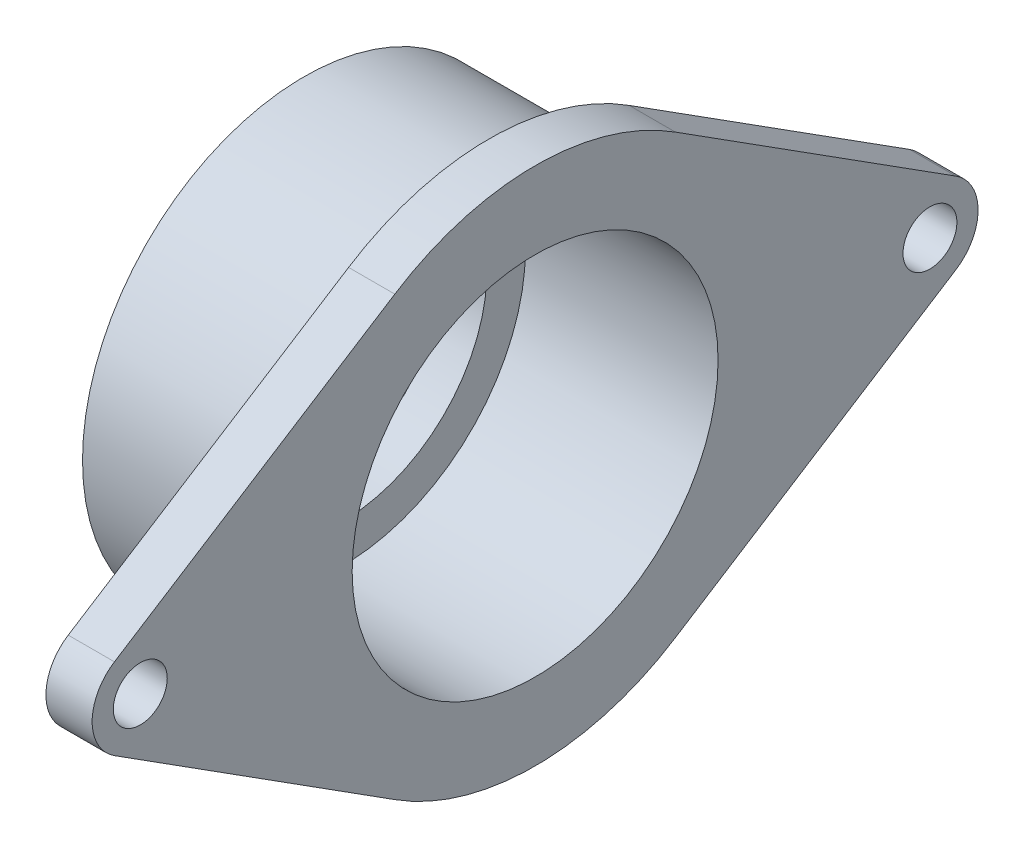
ISO-10303-21;
HEADER;
FILE_DESCRIPTION(('STEP AP214'),'2;1');
FILE_NAME('part.step','',(''),(''),'','','');
FILE_SCHEMA(('AUTOMOTIVE_DESIGN { 1 0 10303 214 1 1 1 1 }'));
ENDSEC;
DATA;
#1=APPLICATION_CONTEXT('core data for automotive mechanical design processes');
#2=APPLICATION_PROTOCOL_DEFINITION('international standard','automotive_design',2000,#1);
#3=PRODUCT_CONTEXT('',#1,'mechanical');
#4=PRODUCT('Part','Part','',(#3));
#5=PRODUCT_RELATED_PRODUCT_CATEGORY('part','',(#4));
#6=PRODUCT_DEFINITION_FORMATION('','',#4);
#7=PRODUCT_DEFINITION_CONTEXT('part definition',#1,'design');
#8=PRODUCT_DEFINITION('design','',#6,#7);
#9=PRODUCT_DEFINITION_SHAPE('','',#8);
#10=(LENGTH_UNIT() NAMED_UNIT(*) SI_UNIT(.MILLI.,.METRE.));
#11=(NAMED_UNIT(*) PLANE_ANGLE_UNIT() SI_UNIT($,.RADIAN.));
#12=(NAMED_UNIT(*) SI_UNIT($,.STERADIAN.) SOLID_ANGLE_UNIT());
#13=UNCERTAINTY_MEASURE_WITH_UNIT(LENGTH_MEASURE(1.E-05),#10,'distance_accuracy_value','');
#14=(GEOMETRIC_REPRESENTATION_CONTEXT(3) GLOBAL_UNCERTAINTY_ASSIGNED_CONTEXT((#13)) GLOBAL_UNIT_ASSIGNED_CONTEXT((#10,
#11,#12)) REPRESENTATION_CONTEXT('',''));
#15=CARTESIAN_POINT('',(0.,0.,0.));
#16=DIRECTION('',(0.,0.,1.));
#17=DIRECTION('',(1.,0.,0.));
#18=AXIS2_PLACEMENT_3D('',#15,#16,#17);
#19=CARTESIAN_POINT('',(-85.8939756869317,-12.8582856635851,0.));
#20=DIRECTION('',(-1.,0.,0.));
#21=DIRECTION('',(0.,0.,1.));
#22=AXIS2_PLACEMENT_3D('',#19,#20,#21);
#23=CYLINDRICAL_SURFACE('',#22,57.5);
#24=CARTESIAN_POINT('',(-85.8939756869318,-12.8582856635851,0.));
#25=DIRECTION('',(-1.,0.,0.));
#26=DIRECTION('',(0.,0.,1.));
#27=AXIS2_PLACEMENT_3D('',#24,#25,#26);
#28=CIRCLE('',#27,57.5);
#29=CARTESIAN_POINT('',(-85.8939756869318,-12.8582856635851,57.5));
#30=VERTEX_POINT('',#29);
#31=EDGE_CURVE('E176',#30,#30,#28,.T.);
#32=ORIENTED_EDGE('',*,*,#31,.F.);
#33=EDGE_LOOP('',(#32));
#34=FACE_BOUND('',#33,.T.);
#35=CARTESIAN_POINT('',(-37.8939756869318,-12.8582856635851,0.));
#36=DIRECTION('',(1.,0.,0.));
#37=DIRECTION('',(0.,0.,-1.));
#38=AXIS2_PLACEMENT_3D('',#35,#36,#37);
#39=CIRCLE('',#38,57.5);
#40=CARTESIAN_POINT('',(-37.8939756869318,-12.8582856635851,-57.5));
#41=VERTEX_POINT('',#40);
#42=EDGE_CURVE('E11',#41,#41,#39,.T.);
#43=ORIENTED_EDGE('',*,*,#42,.F.);
#44=EDGE_LOOP('',(#43));
#45=FACE_BOUND('',#44,.T.);
#46=ADVANCED_FACE('F34',(#34,#45),#23,.T.);
#47=CARTESIAN_POINT('',(-85.8939756869317,-12.8582856635851,0.));
#48=DIRECTION('',(-1.,0.,0.));
#49=DIRECTION('',(0.,0.,1.));
#50=AXIS2_PLACEMENT_3D('',#47,#48,#49);
#51=CYLINDRICAL_SURFACE('',#50,47.5);
#52=CARTESIAN_POINT('',(-25.8939756869318,-12.8582856635851,0.));
#53=DIRECTION('',(-1.,0.,0.));
#54=DIRECTION('',(0.,0.,1.));
#55=AXIS2_PLACEMENT_3D('',#52,#53,#54);
#56=CIRCLE('',#55,47.5);
#57=CARTESIAN_POINT('',(-25.8939756869318,-12.8582856635851,47.5));
#58=VERTEX_POINT('',#57);
#59=EDGE_CURVE('E43',#58,#58,#56,.T.);
#60=ORIENTED_EDGE('',*,*,#59,.F.);
#61=EDGE_LOOP('',(#60));
#62=FACE_BOUND('',#61,.T.);
#63=CARTESIAN_POINT('',(-75.8939756869318,-12.8582856635851,0.));
#64=DIRECTION('',(-1.,0.,0.));
#65=DIRECTION('',(0.,0.,1.));
#66=AXIS2_PLACEMENT_3D('',#63,#64,#65);
#67=CIRCLE('',#66,47.5);
#68=CARTESIAN_POINT('',(-75.8939756869318,-12.8582856635851,47.5));
#69=VERTEX_POINT('',#68);
#70=EDGE_CURVE('E158',#69,#69,#67,.T.);
#71=ORIENTED_EDGE('',*,*,#70,.T.);
#72=EDGE_LOOP('',(#71));
#73=FACE_BOUND('',#72,.T.);
#74=ADVANCED_FACE('F36',(#62,#73),#51,.F.);
#75=CARTESIAN_POINT('',(-25.8939756869318,0.,0.));
#76=DIRECTION('',(-1.,0.,0.));
#77=DIRECTION('',(0.,0.,1.));
#78=AXIS2_PLACEMENT_3D('',#75,#76,#77);
#79=PLANE('',#78);
#80=CARTESIAN_POINT('',(-25.8939756869318,-12.8582856636099,102.500000000016));
#81=DIRECTION('',(1.,0.,0.));
#82=DIRECTION('',(0.,0.,-1.));
#83=AXIS2_PLACEMENT_3D('',#80,#81,#82);
#84=CIRCLE('',#83,7.);
#85=CARTESIAN_POINT('',(-25.8939756869318,-12.8582856636099,95.5000000000157));
#86=VERTEX_POINT('',#85);
#87=EDGE_CURVE('E256',#86,#86,#84,.T.);
#88=ORIENTED_EDGE('',*,*,#87,.F.);
#89=EDGE_LOOP('',(#88));
#90=FACE_BOUND('',#89,.T.);
#91=CARTESIAN_POINT('',(-25.8939756869318,-12.8582856635604,-102.500000000016));
#92=DIRECTION('',(1.,0.,0.));
#93=DIRECTION('',(0.,0.,-1.));
#94=AXIS2_PLACEMENT_3D('',#91,#92,#93);
#95=CIRCLE('',#94,7.);
#96=CARTESIAN_POINT('',(-25.8939756869318,-12.8582856635604,-109.500000000016));
#97=VERTEX_POINT('',#96);
#98=EDGE_CURVE('E259',#97,#97,#95,.T.);
#99=ORIENTED_EDGE('',*,*,#98,.F.);
#100=EDGE_LOOP('',(#99));
#101=FACE_BOUND('',#100,.T.);
#102=ORIENTED_EDGE('',*,*,#59,.T.);
#103=EDGE_LOOP('',(#102));
#104=FACE_BOUND('',#103,.T.);
#105=CARTESIAN_POINT('',(-25.8939756869318,-12.8582856635851,0.));
#106=DIRECTION('',(1.,0.,0.));
#107=DIRECTION('',(0.,0.,-1.));
#108=AXIS2_PLACEMENT_3D('',#105,#106,#107);
#109=CIRCLE('',#108,67.5);
#110=CARTESIAN_POINT('',(-25.8939756869318,-69.6866497760731,36.4250879518292));
#111=VERTEX_POINT('',#110);
#112=CARTESIAN_POINT('',(-25.8939756869318,-69.686649776073,-36.4250879518293));
#113=VERTEX_POINT('',#112);
#114=EDGE_CURVE('E134',#111,#113,#109,.T.);
#115=ORIENTED_EDGE('',*,*,#114,.T.);
#116=DIRECTION('',(0.,0.536581054766727,-0.843848784833768));
#117=VECTOR('',#116,1.);
#118=CARTESIAN_POINT('',(-25.8939756869318,-69.686649776073,-36.4250879518293));
#119=LINE('',#118,#117);
#120=CARTESIAN_POINT('',(-25.8939756869318,-23.406395474,-109.207263184572));
#121=VERTEX_POINT('',#120);
#122=EDGE_CURVE('E137',#113,#121,#119,.T.);
#123=ORIENTED_EDGE('',*,*,#122,.T.);
#124=CARTESIAN_POINT('',(-25.8939756869318,-12.8582856635604,-102.500000000016));
#125=DIRECTION('',(1.,0.,0.));
#126=DIRECTION('',(0.,0.,-1.));
#127=AXIS2_PLACEMENT_3D('',#124,#125,#126);
#128=CIRCLE('',#127,12.5);
#129=CARTESIAN_POINT('',(-25.8939756869318,-2.31017585313501,-109.207263184595));
#130=VERTEX_POINT('',#129);
#131=EDGE_CURVE('E141',#121,#130,#128,.T.);
#132=ORIENTED_EDGE('',*,*,#131,.T.);
#133=DIRECTION('',(0.,0.536581054766318,0.843848784834028));
#134=VECTOR('',#133,1.);
#135=CARTESIAN_POINT('',(-25.8939756869318,43.9700784489028,-36.4250879518292));
#136=LINE('',#135,#134);
#137=CARTESIAN_POINT('',(-25.8939756869318,43.9700784489028,-36.4250879518292));
#138=VERTEX_POINT('',#137);
#139=EDGE_CURVE('E144',#130,#138,#136,.T.);
#140=ORIENTED_EDGE('',*,*,#139,.T.);
#141=CARTESIAN_POINT('',(-25.8939756869318,-12.8582856635851,0.));
#142=DIRECTION('',(1.,0.,0.));
#143=DIRECTION('',(0.,0.,-1.));
#144=AXIS2_PLACEMENT_3D('',#141,#142,#143);
#145=CIRCLE('',#144,67.5);
#146=CARTESIAN_POINT('',(-25.8939756869318,43.9700784488884,36.4250879518517));
#147=VERTEX_POINT('',#146);
#148=EDGE_CURVE('E147',#138,#147,#145,.T.);
#149=ORIENTED_EDGE('',*,*,#148,.T.);
#150=DIRECTION('',(0.,-0.536581054766727,0.843848784833768));
#151=VECTOR('',#150,1.);
#152=CARTESIAN_POINT('',(-25.8939756869318,43.9700784488884,36.4250879518517));
#153=LINE('',#152,#151);
#154=CARTESIAN_POINT('',(-25.8939756869318,-2.31017585318461,109.207263184595));
#155=VERTEX_POINT('',#154);
#156=EDGE_CURVE('E150',#147,#155,#153,.T.);
#157=ORIENTED_EDGE('',*,*,#156,.T.);
#158=CARTESIAN_POINT('',(-25.8939756869318,-12.8582856636099,102.500000000016));
#159=DIRECTION('',(1.,0.,0.));
#160=DIRECTION('',(0.,0.,-1.));
#161=AXIS2_PLACEMENT_3D('',#158,#159,#160);
#162=CIRCLE('',#161,12.5);
#163=CARTESIAN_POINT('',(-25.8939756869318,-23.4063954740352,109.207263184595));
#164=VERTEX_POINT('',#163);
#165=EDGE_CURVE('E111',#155,#164,#162,.T.);
#166=ORIENTED_EDGE('',*,*,#165,.T.);
#167=DIRECTION('',(0.,-0.536581054766319,-0.843848784834027));
#168=VECTOR('',#167,1.);
#169=CARTESIAN_POINT('',(-25.8939756869318,-69.6866497760731,36.4250879518292));
#170=LINE('',#169,#168);
#171=EDGE_CURVE('E153',#164,#111,#170,.T.);
#172=ORIENTED_EDGE('',*,*,#171,.T.);
#173=EDGE_LOOP('',(#115,#123,#132,#140,#149,#157,#166,#172));
#174=FACE_BOUND('',#173,.T.);
#175=ADVANCED_FACE('F181',(#90,#101,#104,#174),#79,.F.);
#176=CARTESIAN_POINT('',(-85.8939756869317,0.,0.));
#177=DIRECTION('',(1.,0.,0.));
#178=DIRECTION('',(0.,0.,-1.));
#179=AXIS2_PLACEMENT_3D('',#176,#177,#178);
#180=PLANE('',#179);
#181=CARTESIAN_POINT('',(-85.8939756869317,-12.8582856635851,0.));
#182=DIRECTION('',(-1.,0.,0.));
#183=DIRECTION('',(0.,0.,1.));
#184=AXIS2_PLACEMENT_3D('',#181,#182,#183);
#185=CIRCLE('',#184,37.5);
#186=CARTESIAN_POINT('',(-85.8939756869317,-12.8582856635851,37.5));
#187=VERTEX_POINT('',#186);
#188=EDGE_CURVE('E173',#187,#187,#185,.T.);
#189=ORIENTED_EDGE('',*,*,#188,.F.);
#190=EDGE_LOOP('',(#189));
#191=FACE_BOUND('',#190,.T.);
#192=ORIENTED_EDGE('',*,*,#31,.T.);
#193=EDGE_LOOP('',(#192));
#194=FACE_BOUND('',#193,.T.);
#195=ADVANCED_FACE('F198',(#191,#194),#180,.F.);
#196=CARTESIAN_POINT('',(-85.8939756869317,-12.8582856635851,0.));
#197=DIRECTION('',(-1.,0.,0.));
#198=DIRECTION('',(0.,0.,1.));
#199=AXIS2_PLACEMENT_3D('',#196,#197,#198);
#200=CYLINDRICAL_SURFACE('',#199,37.5);
#201=CARTESIAN_POINT('',(-75.8939756869318,-12.8582856635851,0.));
#202=DIRECTION('',(-1.,0.,0.));
#203=DIRECTION('',(0.,0.,1.));
#204=AXIS2_PLACEMENT_3D('',#201,#202,#203);
#205=CIRCLE('',#204,37.5);
#206=CARTESIAN_POINT('',(-75.8939756869318,-12.8582856635851,37.5));
#207=VERTEX_POINT('',#206);
#208=EDGE_CURVE('E170',#207,#207,#205,.T.);
#209=ORIENTED_EDGE('',*,*,#208,.F.);
#210=EDGE_LOOP('',(#209));
#211=FACE_BOUND('',#210,.T.);
#212=ORIENTED_EDGE('',*,*,#188,.T.);
#213=EDGE_LOOP('',(#212));
#214=FACE_BOUND('',#213,.T.);
#215=ADVANCED_FACE('F192',(#211,#214),#200,.F.);
#216=CARTESIAN_POINT('',(-75.8939756869318,0.,0.));
#217=DIRECTION('',(-1.,0.,0.));
#218=DIRECTION('',(0.,0.,1.));
#219=AXIS2_PLACEMENT_3D('',#216,#217,#218);
#220=PLANE('',#219);
#221=ORIENTED_EDGE('',*,*,#70,.F.);
#222=EDGE_LOOP('',(#221));
#223=FACE_BOUND('',#222,.T.);
#224=ORIENTED_EDGE('',*,*,#208,.T.);
#225=EDGE_LOOP('',(#224));
#226=FACE_BOUND('',#225,.T.);
#227=ADVANCED_FACE('F188',(#223,#226),#220,.F.);
#228=CARTESIAN_POINT('',(-37.8939756869318,-12.8582856635851,0.));
#229=DIRECTION('',(1.,0.,0.));
#230=DIRECTION('',(0.,0.,-1.));
#231=AXIS2_PLACEMENT_3D('',#228,#229,#230);
#232=CYLINDRICAL_SURFACE('',#231,67.5);
#233=ORIENTED_EDGE('',*,*,#114,.F.);
#234=DIRECTION('',(1.,0.,0.));
#235=VECTOR('',#234,1.);
#236=CARTESIAN_POINT('',(-37.8939756869318,-69.6866497760731,36.4250879518292));
#237=LINE('',#236,#235);
#238=CARTESIAN_POINT('',(-37.8939756869318,-69.6866497760731,36.4250879518292));
#239=VERTEX_POINT('',#238);
#240=EDGE_CURVE('E51',#239,#111,#237,.T.);
#241=ORIENTED_EDGE('',*,*,#240,.F.);
#242=CARTESIAN_POINT('',(-37.8939756869318,-12.8582856635851,0.));
#243=DIRECTION('',(1.,0.,0.));
#244=DIRECTION('',(0.,0.,-1.));
#245=AXIS2_PLACEMENT_3D('',#242,#243,#244);
#246=CIRCLE('',#245,67.5);
#247=CARTESIAN_POINT('',(-37.8939756869318,-69.686649776073,-36.4250879518293));
#248=VERTEX_POINT('',#247);
#249=EDGE_CURVE('E156',#239,#248,#246,.T.);
#250=ORIENTED_EDGE('',*,*,#249,.T.);
#251=DIRECTION('',(1.,0.,0.));
#252=VECTOR('',#251,1.);
#253=CARTESIAN_POINT('',(-37.8939756869318,-69.686649776073,-36.4250879518293));
#254=LINE('',#253,#252);
#255=EDGE_CURVE('E92',#248,#113,#254,.T.);
#256=ORIENTED_EDGE('',*,*,#255,.T.);
#257=EDGE_LOOP('',(#233,#241,#250,#256));
#258=FACE_BOUND('',#257,.T.);
#259=ADVANCED_FACE('F191',(#258),#232,.T.);
#260=CARTESIAN_POINT('',(-37.8939756869318,-69.6866497760731,36.4250879518292));
#261=DIRECTION('',(0.,-0.843848784834027,0.536581054766319));
#262=DIRECTION('',(0.,-0.536581054766319,-0.843848784834028));
#263=AXIS2_PLACEMENT_3D('',#260,#261,#262);
#264=PLANE('',#263);
#265=ORIENTED_EDGE('',*,*,#171,.F.);
#266=DIRECTION('',(1.,0.,0.));
#267=VECTOR('',#266,1.);
#268=CARTESIAN_POINT('',(-37.8939756869318,-23.4063954740352,109.207263184595));
#269=LINE('',#268,#267);
#270=CARTESIAN_POINT('',(-37.8939756869318,-23.4063954740352,109.207263184595));
#271=VERTEX_POINT('',#270);
#272=EDGE_CURVE('E80',#271,#164,#269,.T.);
#273=ORIENTED_EDGE('',*,*,#272,.F.);
#274=DIRECTION('',(0.,-0.536581054766319,-0.843848784834027));
#275=VECTOR('',#274,1.);
#276=CARTESIAN_POINT('',(-37.8939756869318,-69.6866497760731,36.4250879518292));
#277=LINE('',#276,#275);
#278=EDGE_CURVE('E124',#271,#239,#277,.T.);
#279=ORIENTED_EDGE('',*,*,#278,.T.);
#280=ORIENTED_EDGE('',*,*,#240,.T.);
#281=EDGE_LOOP('',(#265,#273,#279,#280));
#282=FACE_BOUND('',#281,.T.);
#283=ADVANCED_FACE('F230',(#282),#264,.T.);
#284=CARTESIAN_POINT('',(-37.8939756869318,-12.8582856636099,102.500000000016));
#285=DIRECTION('',(1.,0.,0.));
#286=DIRECTION('',(0.,0.,-1.));
#287=AXIS2_PLACEMENT_3D('',#284,#285,#286);
#288=CYLINDRICAL_SURFACE('',#287,12.5);
#289=ORIENTED_EDGE('',*,*,#165,.F.);
#290=DIRECTION('',(1.,0.,0.));
#291=VECTOR('',#290,1.);
#292=CARTESIAN_POINT('',(-37.8939756869318,-2.31017585318461,109.207263184595));
#293=LINE('',#292,#291);
#294=CARTESIAN_POINT('',(-37.8939756869318,-2.31017585318461,109.207263184595));
#295=VERTEX_POINT('',#294);
#296=EDGE_CURVE('E106',#295,#155,#293,.T.);
#297=ORIENTED_EDGE('',*,*,#296,.F.);
#298=CARTESIAN_POINT('',(-37.8939756869318,-12.8582856636099,102.500000000016));
#299=DIRECTION('',(1.,0.,0.));
#300=DIRECTION('',(0.,0.,-1.));
#301=AXIS2_PLACEMENT_3D('',#298,#299,#300);
#302=CIRCLE('',#301,12.5);
#303=EDGE_CURVE('E109',#295,#271,#302,.T.);
#304=ORIENTED_EDGE('',*,*,#303,.T.);
#305=ORIENTED_EDGE('',*,*,#272,.T.);
#306=EDGE_LOOP('',(#289,#297,#304,#305));
#307=FACE_BOUND('',#306,.T.);
#308=ADVANCED_FACE('F108',(#307),#288,.T.);
#309=CARTESIAN_POINT('',(-37.8939756869318,43.9700784488884,36.4250879518517));
#310=DIRECTION('',(0.,0.843848784833768,0.536581054766727));
#311=DIRECTION('',(0.,-0.536581054766727,0.843848784833768));
#312=AXIS2_PLACEMENT_3D('',#309,#310,#311);
#313=PLANE('',#312);
#314=ORIENTED_EDGE('',*,*,#156,.F.);
#315=DIRECTION('',(1.,0.,0.));
#316=VECTOR('',#315,1.);
#317=CARTESIAN_POINT('',(-37.8939756869318,43.9700784488884,36.4250879518517));
#318=LINE('',#317,#316);
#319=CARTESIAN_POINT('',(-37.8939756869318,43.9700784488884,36.4250879518517));
#320=VERTEX_POINT('',#319);
#321=EDGE_CURVE('E116',#320,#147,#318,.T.);
#322=ORIENTED_EDGE('',*,*,#321,.F.);
#323=DIRECTION('',(0.,-0.536581054766727,0.843848784833768));
#324=VECTOR('',#323,1.);
#325=CARTESIAN_POINT('',(-37.8939756869318,43.9700784488884,36.4250879518517));
#326=LINE('',#325,#324);
#327=EDGE_CURVE('E122',#320,#295,#326,.T.);
#328=ORIENTED_EDGE('',*,*,#327,.T.);
#329=ORIENTED_EDGE('',*,*,#296,.T.);
#330=EDGE_LOOP('',(#314,#322,#328,#329));
#331=FACE_BOUND('',#330,.T.);
#332=ADVANCED_FACE('F126',(#331),#313,.T.);
#333=CARTESIAN_POINT('',(-37.8939756869318,-12.8582856635851,0.));
#334=DIRECTION('',(1.,0.,0.));
#335=DIRECTION('',(0.,0.,-1.));
#336=AXIS2_PLACEMENT_3D('',#333,#334,#335);
#337=CYLINDRICAL_SURFACE('',#336,67.5);
#338=ORIENTED_EDGE('',*,*,#148,.F.);
#339=DIRECTION('',(1.,0.,0.));
#340=VECTOR('',#339,1.);
#341=CARTESIAN_POINT('',(-37.8939756869318,43.9700784489028,-36.4250879518292));
#342=LINE('',#341,#340);
#343=CARTESIAN_POINT('',(-37.8939756869318,43.9700784489028,-36.4250879518292));
#344=VERTEX_POINT('',#343);
#345=EDGE_CURVE('E161',#344,#138,#342,.T.);
#346=ORIENTED_EDGE('',*,*,#345,.F.);
#347=CARTESIAN_POINT('',(-37.8939756869318,-12.8582856635851,0.));
#348=DIRECTION('',(1.,0.,0.));
#349=DIRECTION('',(0.,0.,-1.));
#350=AXIS2_PLACEMENT_3D('',#347,#348,#349);
#351=CIRCLE('',#350,67.5);
#352=EDGE_CURVE('E127',#344,#320,#351,.T.);
#353=ORIENTED_EDGE('',*,*,#352,.T.);
#354=ORIENTED_EDGE('',*,*,#321,.T.);
#355=EDGE_LOOP('',(#338,#346,#353,#354));
#356=FACE_BOUND('',#355,.T.);
#357=ADVANCED_FACE('F237',(#356),#337,.T.);
#358=CARTESIAN_POINT('',(-37.8939756869318,43.9700784489028,-36.4250879518292));
#359=DIRECTION('',(0.,0.843848784834028,-0.536581054766318));
#360=DIRECTION('',(0.,0.536581054766319,0.843848784834028));
#361=AXIS2_PLACEMENT_3D('',#358,#359,#360);
#362=PLANE('',#361);
#363=ORIENTED_EDGE('',*,*,#139,.F.);
#364=DIRECTION('',(1.,0.,0.));
#365=VECTOR('',#364,1.);
#366=CARTESIAN_POINT('',(-37.8939756869318,-2.31017585313501,-109.207263184595));
#367=LINE('',#366,#365);
#368=CARTESIAN_POINT('',(-37.8939756869318,-2.31017585313501,-109.207263184595));
#369=VERTEX_POINT('',#368);
#370=EDGE_CURVE('E163',#369,#130,#367,.T.);
#371=ORIENTED_EDGE('',*,*,#370,.F.);
#372=DIRECTION('',(0.,0.536581054766318,0.843848784834028));
#373=VECTOR('',#372,1.);
#374=CARTESIAN_POINT('',(-37.8939756869318,43.9700784489028,-36.4250879518292));
#375=LINE('',#374,#373);
#376=EDGE_CURVE('E129',#369,#344,#375,.T.);
#377=ORIENTED_EDGE('',*,*,#376,.T.);
#378=ORIENTED_EDGE('',*,*,#345,.T.);
#379=EDGE_LOOP('',(#363,#371,#377,#378));
#380=FACE_BOUND('',#379,.T.);
#381=ADVANCED_FACE('F240',(#380),#362,.T.);
#382=CARTESIAN_POINT('',(-37.8939756869318,-12.8582856635604,-102.500000000016));
#383=DIRECTION('',(1.,0.,0.));
#384=DIRECTION('',(0.,0.,-1.));
#385=AXIS2_PLACEMENT_3D('',#382,#383,#384);
#386=CYLINDRICAL_SURFACE('',#385,12.5);
#387=ORIENTED_EDGE('',*,*,#131,.F.);
#388=DIRECTION('',(1.,0.,0.));
#389=VECTOR('',#388,1.);
#390=CARTESIAN_POINT('',(-37.8939756869318,-23.406395474,-109.207263184572));
#391=LINE('',#390,#389);
#392=CARTESIAN_POINT('',(-37.8939756869318,-23.406395474,-109.207263184572));
#393=VERTEX_POINT('',#392);
#394=EDGE_CURVE('E165',#393,#121,#391,.T.);
#395=ORIENTED_EDGE('',*,*,#394,.F.);
#396=CARTESIAN_POINT('',(-37.8939756869318,-12.8582856635604,-102.500000000016));
#397=DIRECTION('',(1.,0.,0.));
#398=DIRECTION('',(0.,0.,-1.));
#399=AXIS2_PLACEMENT_3D('',#396,#397,#398);
#400=CIRCLE('',#399,12.5);
#401=EDGE_CURVE('E270',#393,#369,#400,.T.);
#402=ORIENTED_EDGE('',*,*,#401,.T.);
#403=ORIENTED_EDGE('',*,*,#370,.T.);
#404=EDGE_LOOP('',(#387,#395,#402,#403));
#405=FACE_BOUND('',#404,.T.);
#406=ADVANCED_FACE('F224',(#405),#386,.T.);
#407=CARTESIAN_POINT('',(-37.8939756869318,-69.686649776073,-36.4250879518293));
#408=DIRECTION('',(0.,-0.843848784833768,-0.536581054766727));
#409=DIRECTION('',(0.,0.536581054766727,-0.843848784833768));
#410=AXIS2_PLACEMENT_3D('',#407,#408,#409);
#411=PLANE('',#410);
#412=ORIENTED_EDGE('',*,*,#122,.F.);
#413=ORIENTED_EDGE('',*,*,#255,.F.);
#414=DIRECTION('',(0.,0.536581054766727,-0.843848784833768));
#415=VECTOR('',#414,1.);
#416=CARTESIAN_POINT('',(-37.8939756869318,-69.686649776073,-36.4250879518293));
#417=LINE('',#416,#415);
#418=EDGE_CURVE('E268',#248,#393,#417,.T.);
#419=ORIENTED_EDGE('',*,*,#418,.T.);
#420=ORIENTED_EDGE('',*,*,#394,.T.);
#421=EDGE_LOOP('',(#412,#413,#419,#420));
#422=FACE_BOUND('',#421,.T.);
#423=ADVANCED_FACE('F214',(#422),#411,.T.);
#424=CARTESIAN_POINT('',(-37.8939756869318,-12.8582856635851,0.));
#425=DIRECTION('',(1.,0.,0.));
#426=DIRECTION('',(0.,0.,-1.));
#427=AXIS2_PLACEMENT_3D('',#424,#425,#426);
#428=PLANE('',#427);
#429=CARTESIAN_POINT('',(-37.8939756869318,-12.8582856636099,102.500000000016));
#430=DIRECTION('',(1.,0.,0.));
#431=DIRECTION('',(0.,0.,-1.));
#432=AXIS2_PLACEMENT_3D('',#429,#430,#431);
#433=CIRCLE('',#432,7.);
#434=CARTESIAN_POINT('',(-37.8939756869318,-12.8582856636099,95.5000000000157));
#435=VERTEX_POINT('',#434);
#436=EDGE_CURVE('E138',#435,#435,#433,.T.);
#437=ORIENTED_EDGE('',*,*,#436,.T.);
#438=EDGE_LOOP('',(#437));
#439=FACE_BOUND('',#438,.T.);
#440=CARTESIAN_POINT('',(-37.8939756869318,-12.8582856635604,-102.500000000016));
#441=DIRECTION('',(1.,0.,0.));
#442=DIRECTION('',(0.,0.,-1.));
#443=AXIS2_PLACEMENT_3D('',#440,#441,#442);
#444=CIRCLE('',#443,7.);
#445=CARTESIAN_POINT('',(-37.8939756869318,-12.8582856635604,-109.500000000016));
#446=VERTEX_POINT('',#445);
#447=EDGE_CURVE('E261',#446,#446,#444,.T.);
#448=ORIENTED_EDGE('',*,*,#447,.T.);
#449=EDGE_LOOP('',(#448));
#450=FACE_BOUND('',#449,.T.);
#451=ORIENTED_EDGE('',*,*,#42,.T.);
#452=EDGE_LOOP('',(#451));
#453=FACE_BOUND('',#452,.T.);
#454=ORIENTED_EDGE('',*,*,#249,.F.);
#455=ORIENTED_EDGE('',*,*,#278,.F.);
#456=ORIENTED_EDGE('',*,*,#303,.F.);
#457=ORIENTED_EDGE('',*,*,#327,.F.);
#458=ORIENTED_EDGE('',*,*,#352,.F.);
#459=ORIENTED_EDGE('',*,*,#376,.F.);
#460=ORIENTED_EDGE('',*,*,#401,.F.);
#461=ORIENTED_EDGE('',*,*,#418,.F.);
#462=EDGE_LOOP('',(#454,#455,#456,#457,#458,#459,#460,#461));
#463=FACE_BOUND('',#462,.T.);
#464=ADVANCED_FACE('F120',(#439,#450,#453,#463),#428,.F.);
#465=CARTESIAN_POINT('',(-37.8939756869318,-12.8582856635604,-102.500000000016));
#466=DIRECTION('',(1.,0.,0.));
#467=DIRECTION('',(0.,0.,-1.));
#468=AXIS2_PLACEMENT_3D('',#465,#466,#467);
#469=CYLINDRICAL_SURFACE('',#468,7.);
#470=ORIENTED_EDGE('',*,*,#447,.F.);
#471=EDGE_LOOP('',(#470));
#472=FACE_BOUND('',#471,.T.);
#473=ORIENTED_EDGE('',*,*,#98,.T.);
#474=EDGE_LOOP('',(#473));
#475=FACE_BOUND('',#474,.T.);
#476=ADVANCED_FACE('F213',(#472,#475),#469,.F.);
#477=CARTESIAN_POINT('',(-37.8939756869318,-12.8582856636099,102.500000000016));
#478=DIRECTION('',(1.,0.,0.));
#479=DIRECTION('',(0.,0.,-1.));
#480=AXIS2_PLACEMENT_3D('',#477,#478,#479);
#481=CYLINDRICAL_SURFACE('',#480,7.);
#482=ORIENTED_EDGE('',*,*,#436,.F.);
#483=EDGE_LOOP('',(#482));
#484=FACE_BOUND('',#483,.T.);
#485=ORIENTED_EDGE('',*,*,#87,.T.);
#486=EDGE_LOOP('',(#485));
#487=FACE_BOUND('',#486,.T.);
#488=ADVANCED_FACE('F221',(#484,#487),#481,.F.);
#489=CLOSED_SHELL('',(#46,#74,#175,#195,#215,#227,#259,#283,#308,#332,#357,#381,#406,#423,#464,
#476,#488));
#490=MANIFOLD_SOLID_BREP('B2',#489);
#491=ADVANCED_BREP_SHAPE_REPRESENTATION('',(#18,#490),#14);
#492=SHAPE_DEFINITION_REPRESENTATION(#9,#491);
ENDSEC;
END-ISO-10303-21;
